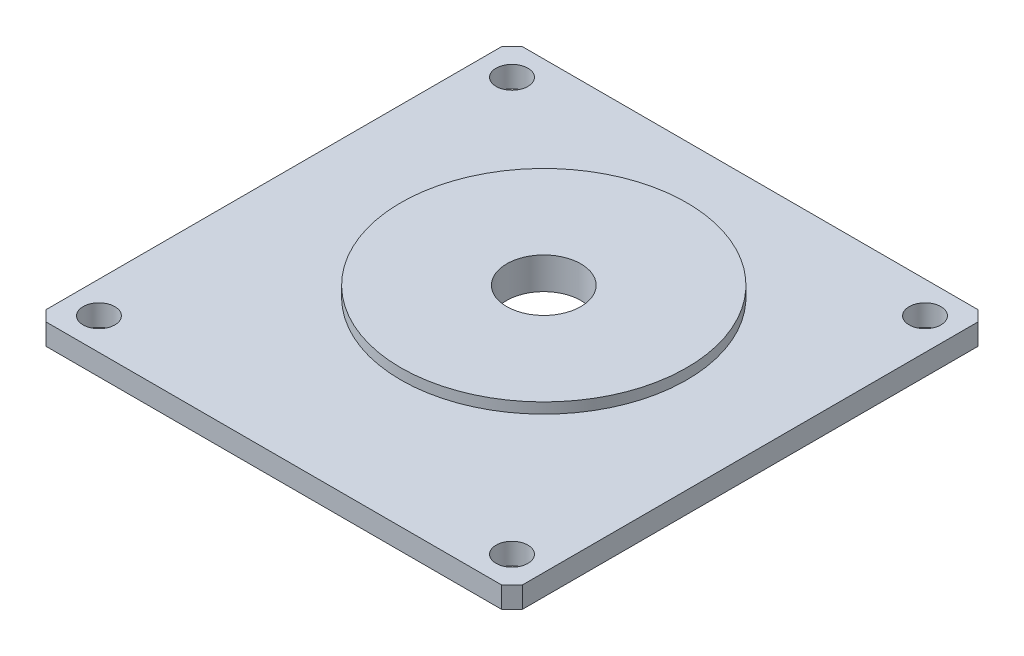
ISO-10303-21;
HEADER;
FILE_DESCRIPTION(('STEP AP214'),'2;1');
FILE_NAME('part.step','',(''),(''),'','','');
FILE_SCHEMA(('AUTOMOTIVE_DESIGN { 1 0 10303 214 1 1 1 1 }'));
ENDSEC;
DATA;
#1=APPLICATION_CONTEXT('core data for automotive mechanical design processes');
#2=APPLICATION_PROTOCOL_DEFINITION('international standard','automotive_design',2000,#1);
#3=PRODUCT_CONTEXT('',#1,'mechanical');
#4=PRODUCT('Part','Part','',(#3));
#5=PRODUCT_RELATED_PRODUCT_CATEGORY('part','',(#4));
#6=PRODUCT_DEFINITION_FORMATION('','',#4);
#7=PRODUCT_DEFINITION_CONTEXT('part definition',#1,'design');
#8=PRODUCT_DEFINITION('design','',#6,#7);
#9=PRODUCT_DEFINITION_SHAPE('','',#8);
#10=(LENGTH_UNIT() NAMED_UNIT(*) SI_UNIT(.MILLI.,.METRE.));
#11=(NAMED_UNIT(*) PLANE_ANGLE_UNIT() SI_UNIT($,.RADIAN.));
#12=(NAMED_UNIT(*) SI_UNIT($,.STERADIAN.) SOLID_ANGLE_UNIT());
#13=UNCERTAINTY_MEASURE_WITH_UNIT(LENGTH_MEASURE(1.E-05),#10,'distance_accuracy_value','');
#14=(GEOMETRIC_REPRESENTATION_CONTEXT(3) GLOBAL_UNCERTAINTY_ASSIGNED_CONTEXT((#13)) GLOBAL_UNIT_ASSIGNED_CONTEXT((#10,
#11,#12)) REPRESENTATION_CONTEXT('',''));
#15=CARTESIAN_POINT('',(0.,0.,0.));
#16=DIRECTION('',(0.,0.,1.));
#17=DIRECTION('',(1.,0.,0.));
#18=AXIS2_PLACEMENT_3D('',#15,#16,#17);
#19=CARTESIAN_POINT('',(22.5,2.,22.5));
#20=DIRECTION('',(-1.,0.,0.));
#21=DIRECTION('',(0.,0.,1.));
#22=AXIS2_PLACEMENT_3D('',#19,#20,#21);
#23=PLANE('',#22);
#24=DIRECTION('',(0.,0.,-1.));
#25=VECTOR('',#24,1.);
#26=CARTESIAN_POINT('',(22.5,2.,22.5));
#27=LINE('',#26,#25);
#28=CARTESIAN_POINT('',(22.5,2.,21.5));
#29=VERTEX_POINT('',#28);
#30=CARTESIAN_POINT('',(22.5,2.,-21.5));
#31=VERTEX_POINT('',#30);
#32=EDGE_CURVE('E134',#29,#31,#27,.T.);
#33=ORIENTED_EDGE('',*,*,#32,.F.);
#34=DIRECTION('',(0.,-1.,0.));
#35=VECTOR('',#34,1.);
#36=CARTESIAN_POINT('',(22.5,2.,21.5));
#37=LINE('',#36,#35);
#38=CARTESIAN_POINT('',(22.5,0.,21.5));
#39=VERTEX_POINT('',#38);
#40=EDGE_CURVE('E174',#29,#39,#37,.T.);
#41=ORIENTED_EDGE('',*,*,#40,.T.);
#42=DIRECTION('',(0.,0.,-1.));
#43=VECTOR('',#42,1.);
#44=CARTESIAN_POINT('',(22.5,0.,22.5));
#45=LINE('',#44,#43);
#46=CARTESIAN_POINT('',(22.5,0.,-21.5));
#47=VERTEX_POINT('',#46);
#48=EDGE_CURVE('E185',#39,#47,#45,.T.);
#49=ORIENTED_EDGE('',*,*,#48,.T.);
#50=DIRECTION('',(0.,1.,0.));
#51=VECTOR('',#50,1.);
#52=CARTESIAN_POINT('',(22.5,2.,-21.5));
#53=LINE('',#52,#51);
#54=EDGE_CURVE('E171',#47,#31,#53,.T.);
#55=ORIENTED_EDGE('',*,*,#54,.T.);
#56=EDGE_LOOP('',(#33,#41,#49,#55));
#57=FACE_BOUND('',#56,.T.);
#58=ADVANCED_FACE('F39',(#57),#23,.F.);
#59=CARTESIAN_POINT('',(-22.5,2.,-22.5));
#60=DIRECTION('',(0.,0.,1.));
#61=DIRECTION('',(1.,0.,0.));
#62=AXIS2_PLACEMENT_3D('',#59,#60,#61);
#63=PLANE('',#62);
#64=DIRECTION('',(-1.,0.,0.));
#65=VECTOR('',#64,1.);
#66=CARTESIAN_POINT('',(-22.5,0.,-22.5));
#67=LINE('',#66,#65);
#68=CARTESIAN_POINT('',(21.5,0.,-22.5));
#69=VERTEX_POINT('',#68);
#70=CARTESIAN_POINT('',(-21.5,0.,-22.5));
#71=VERTEX_POINT('',#70);
#72=EDGE_CURVE('E141',#69,#71,#67,.T.);
#73=ORIENTED_EDGE('',*,*,#72,.T.);
#74=DIRECTION('',(0.,1.,0.));
#75=VECTOR('',#74,1.);
#76=CARTESIAN_POINT('',(-21.5,2.,-22.5));
#77=LINE('',#76,#75);
#78=CARTESIAN_POINT('',(-21.5,2.,-22.5));
#79=VERTEX_POINT('',#78);
#80=EDGE_CURVE('E11',#71,#79,#77,.T.);
#81=ORIENTED_EDGE('',*,*,#80,.T.);
#82=DIRECTION('',(-1.,0.,0.));
#83=VECTOR('',#82,1.);
#84=CARTESIAN_POINT('',(-22.5,2.,-22.5));
#85=LINE('',#84,#83);
#86=CARTESIAN_POINT('',(21.5,2.,-22.5));
#87=VERTEX_POINT('',#86);
#88=EDGE_CURVE('E139',#87,#79,#85,.T.);
#89=ORIENTED_EDGE('',*,*,#88,.F.);
#90=DIRECTION('',(0.,-1.,0.));
#91=VECTOR('',#90,1.);
#92=CARTESIAN_POINT('',(21.5,2.,-22.5));
#93=LINE('',#92,#91);
#94=EDGE_CURVE('E48',#87,#69,#93,.T.);
#95=ORIENTED_EDGE('',*,*,#94,.T.);
#96=EDGE_LOOP('',(#73,#81,#89,#95));
#97=FACE_BOUND('',#96,.T.);
#98=ADVANCED_FACE('F181',(#97),#63,.F.);
#99=CARTESIAN_POINT('',(-22.5,2.,22.5));
#100=DIRECTION('',(1.,0.,0.));
#101=DIRECTION('',(0.,0.,-1.));
#102=AXIS2_PLACEMENT_3D('',#99,#100,#101);
#103=PLANE('',#102);
#104=DIRECTION('',(0.,0.,1.));
#105=VECTOR('',#104,1.);
#106=CARTESIAN_POINT('',(-22.5,0.,22.5));
#107=LINE('',#106,#105);
#108=CARTESIAN_POINT('',(-22.5,0.,-21.5));
#109=VERTEX_POINT('',#108);
#110=CARTESIAN_POINT('',(-22.5,0.,21.5));
#111=VERTEX_POINT('',#110);
#112=EDGE_CURVE('E135',#109,#111,#107,.T.);
#113=ORIENTED_EDGE('',*,*,#112,.T.);
#114=DIRECTION('',(0.,1.,0.));
#115=VECTOR('',#114,1.);
#116=CARTESIAN_POINT('',(-22.5,2.,21.5));
#117=LINE('',#116,#115);
#118=CARTESIAN_POINT('',(-22.5,2.,21.5));
#119=VERTEX_POINT('',#118);
#120=EDGE_CURVE('E110',#111,#119,#117,.T.);
#121=ORIENTED_EDGE('',*,*,#120,.T.);
#122=DIRECTION('',(0.,0.,1.));
#123=VECTOR('',#122,1.);
#124=CARTESIAN_POINT('',(-22.5,2.,22.5));
#125=LINE('',#124,#123);
#126=CARTESIAN_POINT('',(-22.5,2.,-21.5));
#127=VERTEX_POINT('',#126);
#128=EDGE_CURVE('E192',#127,#119,#125,.T.);
#129=ORIENTED_EDGE('',*,*,#128,.F.);
#130=DIRECTION('',(0.,-1.,0.));
#131=VECTOR('',#130,1.);
#132=CARTESIAN_POINT('',(-22.5,2.,-21.5));
#133=LINE('',#132,#131);
#134=EDGE_CURVE('E116',#127,#109,#133,.T.);
#135=ORIENTED_EDGE('',*,*,#134,.T.);
#136=EDGE_LOOP('',(#113,#121,#129,#135));
#137=FACE_BOUND('',#136,.T.);
#138=ADVANCED_FACE('F267',(#137),#103,.F.);
#139=CARTESIAN_POINT('',(-22.5,2.,22.5));
#140=DIRECTION('',(0.,0.,-1.));
#141=DIRECTION('',(-1.,0.,0.));
#142=AXIS2_PLACEMENT_3D('',#139,#140,#141);
#143=PLANE('',#142);
#144=DIRECTION('',(1.,0.,0.));
#145=VECTOR('',#144,1.);
#146=CARTESIAN_POINT('',(-22.5,2.,22.5));
#147=LINE('',#146,#145);
#148=CARTESIAN_POINT('',(-21.5,2.,22.5));
#149=VERTEX_POINT('',#148);
#150=CARTESIAN_POINT('',(21.5,2.,22.5));
#151=VERTEX_POINT('',#150);
#152=EDGE_CURVE('E126',#149,#151,#147,.T.);
#153=ORIENTED_EDGE('',*,*,#152,.F.);
#154=DIRECTION('',(0.,-1.,0.));
#155=VECTOR('',#154,1.);
#156=CARTESIAN_POINT('',(-21.5,2.,22.5));
#157=LINE('',#156,#155);
#158=CARTESIAN_POINT('',(-21.5,0.,22.5));
#159=VERTEX_POINT('',#158);
#160=EDGE_CURVE('E109',#149,#159,#157,.T.);
#161=ORIENTED_EDGE('',*,*,#160,.T.);
#162=DIRECTION('',(1.,0.,0.));
#163=VECTOR('',#162,1.);
#164=CARTESIAN_POINT('',(-22.5,0.,22.5));
#165=LINE('',#164,#163);
#166=CARTESIAN_POINT('',(21.5,0.,22.5));
#167=VERTEX_POINT('',#166);
#168=EDGE_CURVE('E123',#159,#167,#165,.T.);
#169=ORIENTED_EDGE('',*,*,#168,.T.);
#170=DIRECTION('',(0.,1.,0.));
#171=VECTOR('',#170,1.);
#172=CARTESIAN_POINT('',(21.5,2.,22.5));
#173=LINE('',#172,#171);
#174=EDGE_CURVE('E129',#167,#151,#173,.T.);
#175=ORIENTED_EDGE('',*,*,#174,.T.);
#176=EDGE_LOOP('',(#153,#161,#169,#175));
#177=FACE_BOUND('',#176,.T.);
#178=ADVANCED_FACE('F122',(#177),#143,.F.);
#179=CARTESIAN_POINT('',(0.,2.,0.));
#180=DIRECTION('',(0.,-1.,0.));
#181=DIRECTION('',(0.,0.,-1.));
#182=AXIS2_PLACEMENT_3D('',#179,#180,#181);
#183=PLANE('',#182);
#184=CARTESIAN_POINT('',(19.5,2.,19.5));
#185=DIRECTION('',(0.,-1.,0.));
#186=DIRECTION('',(0.,0.,-1.));
#187=AXIS2_PLACEMENT_3D('',#184,#185,#186);
#188=CIRCLE('',#187,1.5);
#189=CARTESIAN_POINT('',(19.5,2.,18.));
#190=VERTEX_POINT('',#189);
#191=EDGE_CURVE('E212',#190,#190,#188,.F.);
#192=ORIENTED_EDGE('',*,*,#191,.F.);
#193=EDGE_LOOP('',(#192));
#194=FACE_BOUND('',#193,.T.);
#195=CARTESIAN_POINT('',(-19.5,2.,19.5));
#196=DIRECTION('',(0.,-1.,0.));
#197=DIRECTION('',(0.,0.,-1.));
#198=AXIS2_PLACEMENT_3D('',#195,#196,#197);
#199=CIRCLE('',#198,1.5);
#200=CARTESIAN_POINT('',(-19.5,2.,18.));
#201=VERTEX_POINT('',#200);
#202=EDGE_CURVE('E216',#201,#201,#199,.F.);
#203=ORIENTED_EDGE('',*,*,#202,.F.);
#204=EDGE_LOOP('',(#203));
#205=FACE_BOUND('',#204,.T.);
#206=CARTESIAN_POINT('',(-19.5,2.,-19.5));
#207=DIRECTION('',(0.,-1.,0.));
#208=DIRECTION('',(0.,0.,-1.));
#209=AXIS2_PLACEMENT_3D('',#206,#207,#208);
#210=CIRCLE('',#209,1.5);
#211=CARTESIAN_POINT('',(-19.5,2.,-21.));
#212=VERTEX_POINT('',#211);
#213=EDGE_CURVE('E220',#212,#212,#210,.F.);
#214=ORIENTED_EDGE('',*,*,#213,.F.);
#215=EDGE_LOOP('',(#214));
#216=FACE_BOUND('',#215,.T.);
#217=CARTESIAN_POINT('',(19.5,2.,-19.5));
#218=DIRECTION('',(0.,-1.,0.));
#219=DIRECTION('',(0.,0.,-1.));
#220=AXIS2_PLACEMENT_3D('',#217,#218,#219);
#221=CIRCLE('',#220,1.5);
#222=CARTESIAN_POINT('',(19.5,2.,-21.));
#223=VERTEX_POINT('',#222);
#224=EDGE_CURVE('E224',#223,#223,#221,.F.);
#225=ORIENTED_EDGE('',*,*,#224,.F.);
#226=EDGE_LOOP('',(#225));
#227=FACE_BOUND('',#226,.T.);
#228=CARTESIAN_POINT('',(0.,2.,-3.));
#229=DIRECTION('',(0.,1.,0.));
#230=DIRECTION('',(0.,0.,1.));
#231=AXIS2_PLACEMENT_3D('',#228,#229,#230);
#232=CIRCLE('',#231,13.5);
#233=CARTESIAN_POINT('',(0.,2.,10.5));
#234=VERTEX_POINT('',#233);
#235=EDGE_CURVE('E146',#234,#234,#232,.T.);
#236=ORIENTED_EDGE('',*,*,#235,.F.);
#237=EDGE_LOOP('',(#236));
#238=FACE_BOUND('',#237,.T.);
#239=ORIENTED_EDGE('',*,*,#128,.T.);
#240=DIRECTION('',(-0.707106781186545,0.,-0.70710678118655));
#241=VECTOR('',#240,1.);
#242=CARTESIAN_POINT('',(-21.5,2.,22.5));
#243=LINE('',#242,#241);
#244=EDGE_CURVE('E168',#119,#149,#243,.F.);
#245=ORIENTED_EDGE('',*,*,#244,.T.);
#246=ORIENTED_EDGE('',*,*,#152,.T.);
#247=DIRECTION('',(-0.70710678118655,0.,0.707106781186545));
#248=VECTOR('',#247,1.);
#249=CARTESIAN_POINT('',(22.5,2.,21.5));
#250=LINE('',#249,#248);
#251=EDGE_CURVE('E165',#151,#29,#250,.F.);
#252=ORIENTED_EDGE('',*,*,#251,.T.);
#253=ORIENTED_EDGE('',*,*,#32,.T.);
#254=DIRECTION('',(0.707106781186548,0.,0.707106781186548));
#255=VECTOR('',#254,1.);
#256=CARTESIAN_POINT('',(21.5,2.,-22.5));
#257=LINE('',#256,#255);
#258=EDGE_CURVE('E60',#31,#87,#257,.F.);
#259=ORIENTED_EDGE('',*,*,#258,.T.);
#260=ORIENTED_EDGE('',*,*,#88,.T.);
#261=DIRECTION('',(0.70710678118655,0.,-0.707106781186545));
#262=VECTOR('',#261,1.);
#263=CARTESIAN_POINT('',(-22.5,2.,-21.5));
#264=LINE('',#263,#262);
#265=EDGE_CURVE('E162',#79,#127,#264,.F.);
#266=ORIENTED_EDGE('',*,*,#265,.T.);
#267=EDGE_LOOP('',(#239,#245,#246,#252,#253,#259,#260,#266));
#268=FACE_BOUND('',#267,.T.);
#269=ADVANCED_FACE('F255',(#194,#205,#216,#227,#238,#268),#183,.F.);
#270=CARTESIAN_POINT('',(0.,0.,0.));
#271=DIRECTION('',(0.,-1.,0.));
#272=DIRECTION('',(0.,0.,-1.));
#273=AXIS2_PLACEMENT_3D('',#270,#271,#272);
#274=PLANE('',#273);
#275=CARTESIAN_POINT('',(19.5,0.,19.5));
#276=DIRECTION('',(0.,1.,0.));
#277=DIRECTION('',(0.,0.,-1.));
#278=AXIS2_PLACEMENT_3D('',#275,#276,#277);
#279=CIRCLE('',#278,1.5);
#280=CARTESIAN_POINT('',(19.5,0.,18.));
#281=VERTEX_POINT('',#280);
#282=EDGE_CURVE('E233',#281,#281,#279,.T.);
#283=ORIENTED_EDGE('',*,*,#282,.T.);
#284=EDGE_LOOP('',(#283));
#285=FACE_BOUND('',#284,.T.);
#286=CARTESIAN_POINT('',(-19.5,0.,19.5));
#287=DIRECTION('',(0.,1.,0.));
#288=DIRECTION('',(0.,0.,1.));
#289=AXIS2_PLACEMENT_3D('',#286,#287,#288);
#290=CIRCLE('',#289,1.5);
#291=CARTESIAN_POINT('',(-19.5,0.,21.));
#292=VERTEX_POINT('',#291);
#293=EDGE_CURVE('E237',#292,#292,#290,.T.);
#294=ORIENTED_EDGE('',*,*,#293,.T.);
#295=EDGE_LOOP('',(#294));
#296=FACE_BOUND('',#295,.T.);
#297=CARTESIAN_POINT('',(-19.5,0.,-19.5));
#298=DIRECTION('',(0.,1.,0.));
#299=DIRECTION('',(0.,0.,-1.));
#300=AXIS2_PLACEMENT_3D('',#297,#298,#299);
#301=CIRCLE('',#300,1.5);
#302=CARTESIAN_POINT('',(-19.5,0.,-21.));
#303=VERTEX_POINT('',#302);
#304=EDGE_CURVE('E232',#303,#303,#301,.T.);
#305=ORIENTED_EDGE('',*,*,#304,.T.);
#306=EDGE_LOOP('',(#305));
#307=FACE_BOUND('',#306,.T.);
#308=CARTESIAN_POINT('',(19.5,0.,-19.5));
#309=DIRECTION('',(0.,1.,0.));
#310=DIRECTION('',(0.,0.,1.));
#311=AXIS2_PLACEMENT_3D('',#308,#309,#310);
#312=CIRCLE('',#311,1.5);
#313=CARTESIAN_POINT('',(19.5,0.,-18.));
#314=VERTEX_POINT('',#313);
#315=EDGE_CURVE('E228',#314,#314,#312,.T.);
#316=ORIENTED_EDGE('',*,*,#315,.T.);
#317=EDGE_LOOP('',(#316));
#318=FACE_BOUND('',#317,.T.);
#319=CARTESIAN_POINT('',(0.,0.,-3.));
#320=DIRECTION('',(0.,1.,0.));
#321=DIRECTION('',(0.,0.,1.));
#322=AXIS2_PLACEMENT_3D('',#319,#320,#321);
#323=CIRCLE('',#322,3.5);
#324=CARTESIAN_POINT('',(0.,0.,0.5));
#325=VERTEX_POINT('',#324);
#326=EDGE_CURVE('E187',#325,#325,#323,.T.);
#327=ORIENTED_EDGE('',*,*,#326,.T.);
#328=EDGE_LOOP('',(#327));
#329=FACE_BOUND('',#328,.T.);
#330=ORIENTED_EDGE('',*,*,#168,.F.);
#331=DIRECTION('',(0.707106781186545,0.,0.70710678118655));
#332=VECTOR('',#331,1.);
#333=CARTESIAN_POINT('',(-22.0000000000001,0.,21.9999999999999));
#334=LINE('',#333,#332);
#335=EDGE_CURVE('E105',#159,#111,#334,.F.);
#336=ORIENTED_EDGE('',*,*,#335,.T.);
#337=ORIENTED_EDGE('',*,*,#112,.F.);
#338=DIRECTION('',(-0.70710678118655,0.,0.707106781186545));
#339=VECTOR('',#338,1.);
#340=CARTESIAN_POINT('',(-21.9999999999999,0.,-22.0000000000001));
#341=LINE('',#340,#339);
#342=EDGE_CURVE('E150',#109,#71,#341,.F.);
#343=ORIENTED_EDGE('',*,*,#342,.T.);
#344=ORIENTED_EDGE('',*,*,#72,.F.);
#345=DIRECTION('',(-0.707106781186548,0.,-0.707106781186548));
#346=VECTOR('',#345,1.);
#347=CARTESIAN_POINT('',(22.,0.,-22.));
#348=LINE('',#347,#346);
#349=EDGE_CURVE('E128',#69,#47,#348,.F.);
#350=ORIENTED_EDGE('',*,*,#349,.T.);
#351=ORIENTED_EDGE('',*,*,#48,.F.);
#352=DIRECTION('',(0.70710678118655,0.,-0.707106781186545));
#353=VECTOR('',#352,1.);
#354=CARTESIAN_POINT('',(21.9999999999999,0.,22.0000000000001));
#355=LINE('',#354,#353);
#356=EDGE_CURVE('E117',#39,#167,#355,.F.);
#357=ORIENTED_EDGE('',*,*,#356,.T.);
#358=EDGE_LOOP('',(#330,#336,#337,#343,#344,#350,#351,#357));
#359=FACE_BOUND('',#358,.T.);
#360=ADVANCED_FACE('F131',(#285,#296,#307,#318,#329,#359),#274,.T.);
#361=CARTESIAN_POINT('',(0.,0.,-3.));
#362=DIRECTION('',(0.,1.,0.));
#363=DIRECTION('',(0.,0.,1.));
#364=AXIS2_PLACEMENT_3D('',#361,#362,#363);
#365=CYLINDRICAL_SURFACE('',#364,3.5);
#366=ORIENTED_EDGE('',*,*,#326,.F.);
#367=EDGE_LOOP('',(#366));
#368=FACE_BOUND('',#367,.T.);
#369=CARTESIAN_POINT('',(0.,3.,-3.));
#370=DIRECTION('',(0.,1.,0.));
#371=DIRECTION('',(0.,0.,1.));
#372=AXIS2_PLACEMENT_3D('',#369,#370,#371);
#373=CIRCLE('',#372,3.5);
#374=CARTESIAN_POINT('',(0.,3.,0.5));
#375=VERTEX_POINT('',#374);
#376=EDGE_CURVE('E208',#375,#375,#373,.T.);
#377=ORIENTED_EDGE('',*,*,#376,.T.);
#378=EDGE_LOOP('',(#377));
#379=FACE_BOUND('',#378,.T.);
#380=ADVANCED_FACE('F310',(#368,#379),#365,.F.);
#381=CARTESIAN_POINT('',(0.,3.,-3.));
#382=DIRECTION('',(0.,1.,0.));
#383=DIRECTION('',(0.,0.,1.));
#384=AXIS2_PLACEMENT_3D('',#381,#382,#383);
#385=PLANE('',#384);
#386=CARTESIAN_POINT('',(0.,3.,-3.));
#387=DIRECTION('',(0.,1.,0.));
#388=DIRECTION('',(0.,0.,1.));
#389=AXIS2_PLACEMENT_3D('',#386,#387,#388);
#390=CIRCLE('',#389,13.5);
#391=CARTESIAN_POINT('',(0.,3.,10.5));
#392=VERTEX_POINT('',#391);
#393=EDGE_CURVE('E201',#392,#392,#390,.T.);
#394=ORIENTED_EDGE('',*,*,#393,.T.);
#395=EDGE_LOOP('',(#394));
#396=FACE_BOUND('',#395,.T.);
#397=ORIENTED_EDGE('',*,*,#376,.F.);
#398=EDGE_LOOP('',(#397));
#399=FACE_BOUND('',#398,.T.);
#400=ADVANCED_FACE('F307',(#396,#399),#385,.T.);
#401=CARTESIAN_POINT('',(0.,3.,-3.));
#402=DIRECTION('',(0.,-1.,0.));
#403=DIRECTION('',(0.,0.,-1.));
#404=AXIS2_PLACEMENT_3D('',#401,#402,#403);
#405=CYLINDRICAL_SURFACE('',#404,13.5);
#406=ORIENTED_EDGE('',*,*,#393,.F.);
#407=EDGE_LOOP('',(#406));
#408=FACE_BOUND('',#407,.T.);
#409=ORIENTED_EDGE('',*,*,#235,.T.);
#410=EDGE_LOOP('',(#409));
#411=FACE_BOUND('',#410,.T.);
#412=ADVANCED_FACE('F305',(#408,#411),#405,.T.);
#413=CARTESIAN_POINT('',(19.5,3.,-19.5));
#414=DIRECTION('',(0.,-1.,0.));
#415=DIRECTION('',(0.,0.,-1.));
#416=AXIS2_PLACEMENT_3D('',#413,#414,#415);
#417=CYLINDRICAL_SURFACE('',#416,1.5);
#418=ORIENTED_EDGE('',*,*,#315,.F.);
#419=EDGE_LOOP('',(#418));
#420=FACE_BOUND('',#419,.T.);
#421=ORIENTED_EDGE('',*,*,#224,.T.);
#422=EDGE_LOOP('',(#421));
#423=FACE_BOUND('',#422,.T.);
#424=ADVANCED_FACE('F251',(#420,#423),#417,.F.);
#425=CARTESIAN_POINT('',(-19.5,3.,-19.5));
#426=DIRECTION('',(0.,-1.,0.));
#427=DIRECTION('',(0.,0.,-1.));
#428=AXIS2_PLACEMENT_3D('',#425,#426,#427);
#429=CYLINDRICAL_SURFACE('',#428,1.5);
#430=ORIENTED_EDGE('',*,*,#304,.F.);
#431=EDGE_LOOP('',(#430));
#432=FACE_BOUND('',#431,.T.);
#433=ORIENTED_EDGE('',*,*,#213,.T.);
#434=EDGE_LOOP('',(#433));
#435=FACE_BOUND('',#434,.T.);
#436=ADVANCED_FACE('F247',(#432,#435),#429,.F.);
#437=CARTESIAN_POINT('',(-19.5,3.,19.5));
#438=DIRECTION('',(0.,-1.,0.));
#439=DIRECTION('',(0.,0.,-1.));
#440=AXIS2_PLACEMENT_3D('',#437,#438,#439);
#441=CYLINDRICAL_SURFACE('',#440,1.5);
#442=ORIENTED_EDGE('',*,*,#293,.F.);
#443=EDGE_LOOP('',(#442));
#444=FACE_BOUND('',#443,.T.);
#445=ORIENTED_EDGE('',*,*,#202,.T.);
#446=EDGE_LOOP('',(#445));
#447=FACE_BOUND('',#446,.T.);
#448=ADVANCED_FACE('F250',(#444,#447),#441,.F.);
#449=CARTESIAN_POINT('',(19.5,3.,19.5));
#450=DIRECTION('',(0.,-1.,0.));
#451=DIRECTION('',(0.,0.,-1.));
#452=AXIS2_PLACEMENT_3D('',#449,#450,#451);
#453=CYLINDRICAL_SURFACE('',#452,1.5);
#454=ORIENTED_EDGE('',*,*,#282,.F.);
#455=EDGE_LOOP('',(#454));
#456=FACE_BOUND('',#455,.T.);
#457=ORIENTED_EDGE('',*,*,#191,.T.);
#458=EDGE_LOOP('',(#457));
#459=FACE_BOUND('',#458,.T.);
#460=ADVANCED_FACE('F289',(#456,#459),#453,.F.);
#461=CARTESIAN_POINT('',(-21.5,2.,22.5));
#462=DIRECTION('',(0.70710678118655,0.,-0.707106781186545));
#463=DIRECTION('',(0.,-1.,0.));
#464=AXIS2_PLACEMENT_3D('',#461,#462,#463);
#465=PLANE('',#464);
#466=ORIENTED_EDGE('',*,*,#244,.F.);
#467=ORIENTED_EDGE('',*,*,#120,.F.);
#468=ORIENTED_EDGE('',*,*,#335,.F.);
#469=ORIENTED_EDGE('',*,*,#160,.F.);
#470=EDGE_LOOP('',(#466,#467,#468,#469));
#471=FACE_BOUND('',#470,.T.);
#472=ADVANCED_FACE('F108',(#471),#465,.F.);
#473=CARTESIAN_POINT('',(22.5,2.,21.5));
#474=DIRECTION('',(-0.707106781186545,0.,-0.70710678118655));
#475=DIRECTION('',(0.,-1.,0.));
#476=AXIS2_PLACEMENT_3D('',#473,#474,#475);
#477=PLANE('',#476);
#478=ORIENTED_EDGE('',*,*,#251,.F.);
#479=ORIENTED_EDGE('',*,*,#174,.F.);
#480=ORIENTED_EDGE('',*,*,#356,.F.);
#481=ORIENTED_EDGE('',*,*,#40,.F.);
#482=EDGE_LOOP('',(#478,#479,#480,#481));
#483=FACE_BOUND('',#482,.T.);
#484=ADVANCED_FACE('F271',(#483),#477,.F.);
#485=CARTESIAN_POINT('',(-22.5,2.,-21.5));
#486=DIRECTION('',(0.707106781186545,0.,0.70710678118655));
#487=DIRECTION('',(0.,-1.,0.));
#488=AXIS2_PLACEMENT_3D('',#485,#486,#487);
#489=PLANE('',#488);
#490=ORIENTED_EDGE('',*,*,#265,.F.);
#491=ORIENTED_EDGE('',*,*,#80,.F.);
#492=ORIENTED_EDGE('',*,*,#342,.F.);
#493=ORIENTED_EDGE('',*,*,#134,.F.);
#494=EDGE_LOOP('',(#490,#491,#492,#493));
#495=FACE_BOUND('',#494,.T.);
#496=ADVANCED_FACE('F269',(#495),#489,.F.);
#497=CARTESIAN_POINT('',(21.5,2.,-22.5));
#498=DIRECTION('',(-0.707106781186547,0.,0.707106781186547));
#499=DIRECTION('',(0.,-1.,0.));
#500=AXIS2_PLACEMENT_3D('',#497,#498,#499);
#501=PLANE('',#500);
#502=ORIENTED_EDGE('',*,*,#258,.F.);
#503=ORIENTED_EDGE('',*,*,#54,.F.);
#504=ORIENTED_EDGE('',*,*,#349,.F.);
#505=ORIENTED_EDGE('',*,*,#94,.F.);
#506=EDGE_LOOP('',(#502,#503,#504,#505));
#507=FACE_BOUND('',#506,.T.);
#508=ADVANCED_FACE('F41',(#507),#501,.F.);
#509=CLOSED_SHELL('',(#58,#98,#138,#178,#269,#360,#380,#400,#412,#424,#436,#448,#460,#472,#484,
#496,#508));
#510=MANIFOLD_SOLID_BREP('B2',#509);
#511=ADVANCED_BREP_SHAPE_REPRESENTATION('',(#18,#510),#14);
#512=SHAPE_DEFINITION_REPRESENTATION(#9,#511);
ENDSEC;
END-ISO-10303-21;
